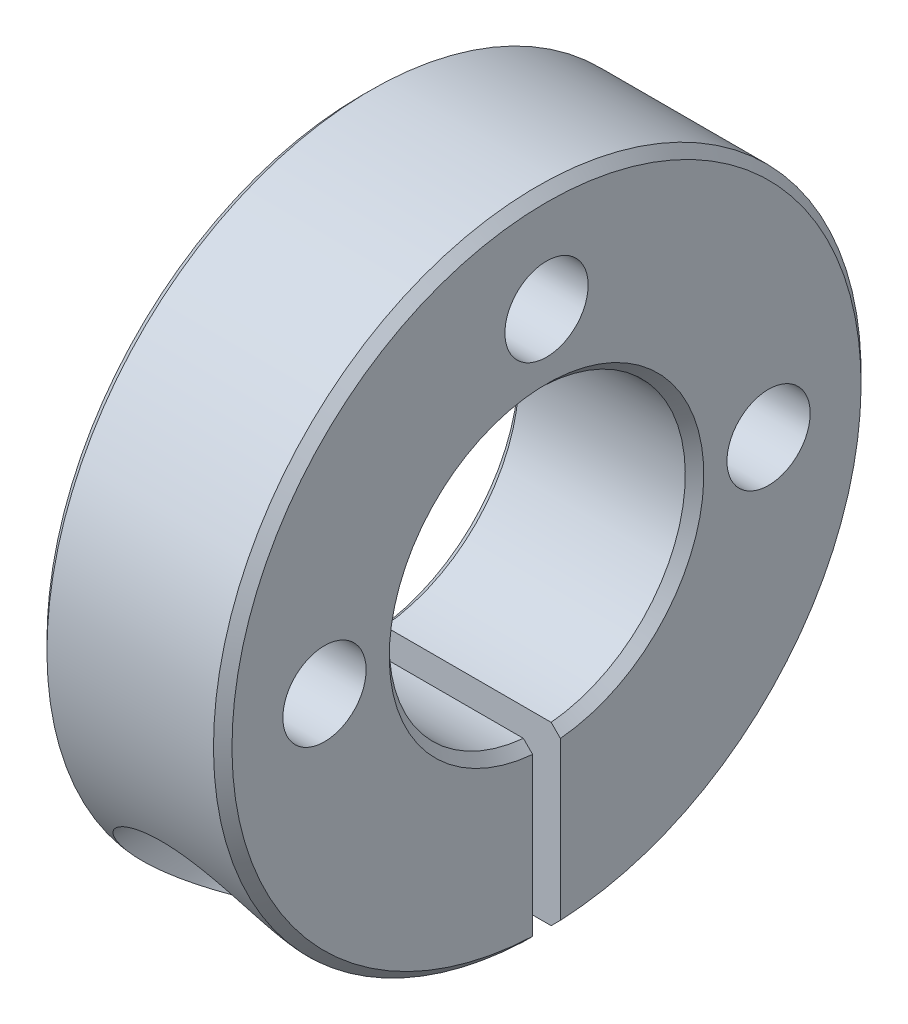
ISO-10303-21;
HEADER;
FILE_DESCRIPTION(('STEP AP214'),'2;1');
FILE_NAME('part.step','',(''),(''),'','','');
FILE_SCHEMA(('AUTOMOTIVE_DESIGN { 1 0 10303 214 1 1 1 1 }'));
ENDSEC;
DATA;
#1=APPLICATION_CONTEXT('core data for automotive mechanical design processes');
#2=APPLICATION_PROTOCOL_DEFINITION('international standard','automotive_design',2000,#1);
#3=PRODUCT_CONTEXT('',#1,'mechanical');
#4=PRODUCT('Part','Part','',(#3));
#5=PRODUCT_RELATED_PRODUCT_CATEGORY('part','',(#4));
#6=PRODUCT_DEFINITION_FORMATION('','',#4);
#7=PRODUCT_DEFINITION_CONTEXT('part definition',#1,'design');
#8=PRODUCT_DEFINITION('design','',#6,#7);
#9=PRODUCT_DEFINITION_SHAPE('','',#8);
#10=(LENGTH_UNIT() NAMED_UNIT(*) SI_UNIT(.MILLI.,.METRE.));
#11=(NAMED_UNIT(*) PLANE_ANGLE_UNIT() SI_UNIT($,.RADIAN.));
#12=(NAMED_UNIT(*) SI_UNIT($,.STERADIAN.) SOLID_ANGLE_UNIT());
#13=UNCERTAINTY_MEASURE_WITH_UNIT(LENGTH_MEASURE(1.E-05),#10,'distance_accuracy_value','');
#14=(GEOMETRIC_REPRESENTATION_CONTEXT(3) GLOBAL_UNCERTAINTY_ASSIGNED_CONTEXT((#13)) GLOBAL_UNIT_ASSIGNED_CONTEXT((#10,
#11,#12)) REPRESENTATION_CONTEXT('',''));
#15=CARTESIAN_POINT('',(0.,0.,0.));
#16=DIRECTION('',(0.,0.,1.));
#17=DIRECTION('',(1.,0.,0.));
#18=AXIS2_PLACEMENT_3D('',#15,#16,#17);
#19=CARTESIAN_POINT('',(0.,-15.625,6.));
#20=DIRECTION('',(0.,0.,-1.));
#21=DIRECTION('',(-1.,0.,0.));
#22=AXIS2_PLACEMENT_3D('',#19,#20,#21);
#23=PLANE('',#22);
#24=CARTESIAN_POINT('',(0.,-12.,6.));
#25=DIRECTION('',(0.,0.,1.));
#26=DIRECTION('',(1.,0.,0.));
#27=AXIS2_PLACEMENT_3D('',#24,#25,#26);
#28=CIRCLE('',#27,2.75);
#29=CARTESIAN_POINT('',(2.75,-12.,6.));
#30=VERTEX_POINT('',#29);
#31=EDGE_CURVE('E142',#30,#30,#28,.F.);
#32=ORIENTED_EDGE('',*,*,#31,.T.);
#33=EDGE_LOOP('',(#32));
#34=FACE_BOUND('',#33,.T.);
#35=CARTESIAN_POINT('',(0.,-12.,6.));
#36=DIRECTION('',(0.,0.,1.));
#37=DIRECTION('',(1.,0.,0.));
#38=AXIS2_PLACEMENT_3D('',#35,#36,#37);
#39=CIRCLE('',#38,4.5);
#40=CARTESIAN_POINT('',(0.73673152950468,-16.4392822227736,6.));
#41=VERTEX_POINT('',#40);
#42=CARTESIAN_POINT('',(-0.736731529504686,-16.4392822227736,6.));
#43=VERTEX_POINT('',#42);
#44=EDGE_CURVE('E201',#41,#43,#39,.T.);
#45=ORIENTED_EDGE('',*,*,#44,.T.);
#46=DIRECTION('',(-1.,0.,0.));
#47=VECTOR('',#46,1.);
#48=CARTESIAN_POINT('',(0.,-16.4392822227736,6.));
#49=LINE('',#48,#47);
#50=EDGE_CURVE('E116',#41,#43,#49,.T.);
#51=ORIENTED_EDGE('',*,*,#50,.F.);
#52=EDGE_LOOP('',(#45,#51));
#53=FACE_BOUND('',#52,.T.);
#54=ADVANCED_FACE('F17',(#34,#53),#23,.F.);
#55=CARTESIAN_POINT('',(5.,0.,0.));
#56=DIRECTION('',(1.,0.,0.));
#57=DIRECTION('',(0.,0.,-1.));
#58=AXIS2_PLACEMENT_3D('',#55,#56,#57);
#59=CONICAL_SURFACE('',#58,8.5,0.785398163397447);
#60=CARTESIAN_POINT('',(5.,0.,0.));
#61=DIRECTION('',(1.,0.,0.));
#62=DIRECTION('',(0.,0.,-1.));
#63=AXIS2_PLACEMENT_3D('',#60,#61,#62);
#64=CIRCLE('',#63,8.5);
#65=CARTESIAN_POINT('',(5.,-8.46684711093805,0.75));
#66=VERTEX_POINT('',#65);
#67=CARTESIAN_POINT('',(5.,-8.46684711093805,-0.75));
#68=VERTEX_POINT('',#67);
#69=EDGE_CURVE('E103',#66,#68,#64,.F.);
#70=ORIENTED_EDGE('',*,*,#69,.F.);
#71=CARTESIAN_POINT('',(4.5,-7.964766161037,0.75));
#72=CARTESIAN_POINT('',(4.58332275788413,-8.04845685099167,0.75));
#73=CARTESIAN_POINT('',(4.66665080349791,-8.13214227513249,0.75));
#74=CARTESIAN_POINT('',(4.83331747016458,-8.29950259176617,0.75));
#75=CARTESIAN_POINT('',(4.91665609121747,-8.38317748425904,0.75));
#76=CARTESIAN_POINT('',(5.,-8.46684711093805,0.75));
#77=B_SPLINE_CURVE_WITH_KNOTS('',3,(#71,#72,#73,#74,#75,#76),.UNSPECIFIED.,.F.,.F.,(4,2,4),(0.,
0.354289882151555,0.70857976421737),.UNSPECIFIED.);
#78=CARTESIAN_POINT('',(4.5,-7.964766161037,0.75));
#79=VERTEX_POINT('',#78);
#80=EDGE_CURVE('E98',#79,#66,#77,.T.);
#81=ORIENTED_EDGE('',*,*,#80,.F.);
#82=CARTESIAN_POINT('',(4.5,0.,0.));
#83=DIRECTION('',(1.,0.,0.));
#84=DIRECTION('',(0.,0.,-1.));
#85=AXIS2_PLACEMENT_3D('',#82,#83,#84);
#86=CIRCLE('',#85,8.);
#87=CARTESIAN_POINT('',(4.5,-7.964766161037,-0.75));
#88=VERTEX_POINT('',#87);
#89=EDGE_CURVE('E95',#79,#88,#86,.F.);
#90=ORIENTED_EDGE('',*,*,#89,.T.);
#91=CARTESIAN_POINT('',(5.,-8.46684711093805,-0.75));
#92=CARTESIAN_POINT('',(4.91665609121747,-8.38317748425903,-0.75));
#93=CARTESIAN_POINT('',(4.83331747016458,-8.29950259176617,-0.75));
#94=CARTESIAN_POINT('',(4.66665080349791,-8.13214227513249,-0.75));
#95=CARTESIAN_POINT('',(4.58332275788413,-8.04845685099167,-0.75));
#96=CARTESIAN_POINT('',(4.5,-7.964766161037,-0.75));
#97=B_SPLINE_CURVE_WITH_KNOTS('',3,(#91,#92,#93,#94,#95,#96),.UNSPECIFIED.,.F.,.F.,(4,2,4),(0.,
0.354289882065815,0.708579764217368),.UNSPECIFIED.);
#98=EDGE_CURVE('E20',#68,#88,#97,.T.);
#99=ORIENTED_EDGE('',*,*,#98,.F.);
#100=EDGE_LOOP('',(#70,#81,#90,#99));
#101=FACE_BOUND('',#100,.T.);
#102=ADVANCED_FACE('F96',(#101),#59,.F.);
#103=CARTESIAN_POINT('',(0.,-12.,11.75));
#104=DIRECTION('',(0.,0.,1.));
#105=DIRECTION('',(1.,0.,0.));
#106=AXIS2_PLACEMENT_3D('',#103,#104,#105);
#107=CYLINDRICAL_SURFACE('',#106,4.5);
#108=ORIENTED_EDGE('',*,*,#44,.F.);
#109=CARTESIAN_POINT('',(4.5,-11.9999999998435,12.7377392030044));
#110=CARTESIAN_POINT('',(4.49999659342949,-12.0897874341693,12.6531545783741));
#111=CARTESIAN_POINT('',(4.49731312864539,-12.1786581120693,12.567636264641));
#112=CARTESIAN_POINT('',(4.48688663633531,-12.3544034048739,12.3949135372549));
#113=CARTESIAN_POINT('',(4.47914482650688,-12.4412784949681,12.3077095343002));
#114=CARTESIAN_POINT('',(4.44881316356375,-12.6984534858054,12.0440633605614));
#115=CARTESIAN_POINT('',(4.41911510353133,-12.8655941536922,11.8653126457182));
#116=CARTESIAN_POINT('',(4.34300028200022,-13.1899676158842,11.5036347251616));
#117=CARTESIAN_POINT('',(4.29663787450371,-13.3472306911807,11.3207228878836));
#118=CARTESIAN_POINT('',(4.18889095652779,-13.652069308479,10.9511831723289));
#119=CARTESIAN_POINT('',(4.12749957141131,-13.7996403778201,10.7645536294696));
#120=CARTESIAN_POINT('',(3.97234024158327,-14.1239410265983,10.3370523978947));
#121=CARTESIAN_POINT('',(3.87431083174871,-14.2975533729783,10.0953554287723));
#122=CARTESIAN_POINT('',(3.65797025694759,-14.6283720850959,9.60974128368812));
#123=CARTESIAN_POINT('',(3.53965059984734,-14.7855715369984,9.36582321876472));
#124=CARTESIAN_POINT('',(3.28294772391242,-15.0840241159876,8.87718244908725));
#125=CARTESIAN_POINT('',(3.14449014430156,-15.2252145310988,8.6324601994707));
#126=CARTESIAN_POINT('',(2.92137069141773,-15.4242486395928,8.26811612733635));
#127=CARTESIAN_POINT('',(2.84445115641557,-15.4884504607233,8.14716110708657));
#128=CARTESIAN_POINT('',(2.68505440427248,-15.6125753987598,7.90669171668996));
#129=CARTESIAN_POINT('',(2.60257700749328,-15.6724983772382,7.78717739325589));
#130=CARTESIAN_POINT('',(2.44457713026749,-15.779111177062,7.56849447785275));
#131=CARTESIAN_POINT('',(2.36991687452591,-15.8264241566887,7.4690068095983));
#132=CARTESIAN_POINT('',(2.21570048504417,-15.9177422565875,7.27236011268131));
#133=CARTESIAN_POINT('',(2.13614567559704,-15.9617482645132,7.17520046393832));
#134=CARTESIAN_POINT('',(1.97209648662688,-16.0458947657934,6.98498274283042));
#135=CARTESIAN_POINT('',(1.88764986079335,-16.0860649462526,6.89189681925615));
#136=CARTESIAN_POINT('',(1.712220341694,-16.1626279531872,6.71037528184055));
#137=CARTESIAN_POINT('',(1.62123814481729,-16.1990211811035,6.62193917427828));
#138=CARTESIAN_POINT('',(1.46789665386435,-16.2543071547525,6.48465075910185));
#139=CARTESIAN_POINT('',(1.40796254193048,-16.274553557651,6.43363905455045));
#140=CARTESIAN_POINT('',(1.28481094764549,-16.3131685469398,6.33508711759034));
#141=CARTESIAN_POINT('',(1.22159675303428,-16.3315389608881,6.28754351976356));
#142=CARTESIAN_POINT('',(1.09065605489364,-16.3663623816907,6.19633599713267));
#143=CARTESIAN_POINT('',(1.02288385375097,-16.3827892170994,6.15272657622926));
#144=CARTESIAN_POINT('',(0.883052649371864,-16.413085151114,6.07145539001137));
#145=CARTESIAN_POINT('',(0.810980866613166,-16.4269460653048,6.03381270963644));
#146=CARTESIAN_POINT('',(0.736731529504679,-16.4392822227736,6.));
#147=B_SPLINE_CURVE_WITH_KNOTS('',3,(#109,#110,#111,#112,#113,#114,#115,#116,#117,#118,#119,
#120,#121,#122,#123,#124,#125,#126,#127,#128,#129,#130,#131,#132,#133,#134,#135,#136,#137,#138,
#139,#140,#141,#142,#143,#144,#145,#146),.UNSPECIFIED.,.F.,.F.,(4,2,2,2,2,2,2,2,2,2,2,2,2,2,2,2,
2,2,4),(0.,0.369981043739814,0.739873054584354,1.47846149267393,2.21466242254255,
2.95120074077436,3.88994335515924,4.82907982731173,5.77177657886501,6.24283785721923,
6.71391436827688,7.11302931588775,7.5120367480017,7.90765137983522,8.30322391982703,
8.54689175245131,8.79031989674821,9.03672247643362,9.28389794154949),.UNSPECIFIED.);
#148=CARTESIAN_POINT('',(4.5,-11.9999999998268,12.7377392030202));
#149=VERTEX_POINT('',#148);
#150=EDGE_CURVE('E102',#149,#41,#147,.T.);
#151=ORIENTED_EDGE('',*,*,#150,.F.);
#152=CARTESIAN_POINT('',(-4.5,-11.99999999981,12.737739203036));
#153=CARTESIAN_POINT('',(-4.49999539061653,-11.8616092664528,12.8681546364716));
#154=CARTESIAN_POINT('',(-4.49361254215694,-11.7209791239297,12.9963428585777));
#155=CARTESIAN_POINT('',(-4.46682850921533,-11.4361114358106,13.2476880032105));
#156=CARTESIAN_POINT('',(-4.44639941679824,-11.2918672603944,13.3708343912689));
#157=CARTESIAN_POINT('',(-4.39006435026275,-11.0002366869138,13.6117915743017));
#158=CARTESIAN_POINT('',(-4.35405630537471,-10.8528357676485,13.7295614174635));
#159=CARTESIAN_POINT('',(-4.26534717436143,-10.5575921225335,13.957864928624));
#160=CARTESIAN_POINT('',(-4.21266081832929,-10.4097499001372,14.0684048784289));
#161=CARTESIAN_POINT('',(-4.10607637056713,-10.155073886505,14.2527950386868));
#162=CARTESIAN_POINT('',(-4.05629224747978,-10.0478750511065,14.3285347856539));
#163=CARTESIAN_POINT('',(-3.9469267446875,-9.83527108127293,14.4752930829882));
#164=CARTESIAN_POINT('',(-3.88734768642697,-9.72986552833794,14.5463127464496));
#165=CARTESIAN_POINT('',(-3.75835851958335,-9.52216893781722,14.6831102548911));
#166=CARTESIAN_POINT('',(-3.68897361374428,-9.41987070823695,14.7489008824213));
#167=CARTESIAN_POINT('',(-3.54025777076305,-9.21932584493091,14.8750818318725));
#168=CARTESIAN_POINT('',(-3.46093165144598,-9.1210772790553,14.9354747455697));
#169=CARTESIAN_POINT('',(-3.2917666677084,-8.92904318946011,15.0510747713074));
#170=CARTESIAN_POINT('',(-3.20184794827299,-8.83530020104871,15.1062359785119));
#171=CARTESIAN_POINT('',(-3.01241487912831,-8.65448186727014,15.2105501837053));
#172=CARTESIAN_POINT('',(-2.91290496754881,-8.5674034711463,15.2597059369457));
#173=CARTESIAN_POINT('',(-2.70472046973333,-8.40107575003517,15.3519048168015));
#174=CARTESIAN_POINT('',(-2.59603690925216,-8.32183426005578,15.3949418446069));
#175=CARTESIAN_POINT('',(-2.37038283582953,-8.17252286823953,15.4747226000714));
#176=CARTESIAN_POINT('',(-2.25341357680604,-8.10245158317862,15.5114672771206));
#177=CARTESIAN_POINT('',(-2.02580991483584,-7.97994244457029,15.5748105614865));
#178=CARTESIAN_POINT('',(-1.91595292317691,-7.92640678307022,15.6020864516105));
#179=CARTESIAN_POINT('',(-1.69129528185993,-7.82812413457123,15.6516294166083));
#180=CARTESIAN_POINT('',(-1.57649517623584,-7.78337618340525,15.6738970410163));
#181=CARTESIAN_POINT('',(-1.34305521321368,-7.70332683043435,15.7133938544858));
#182=CARTESIAN_POINT('',(-1.22442303715565,-7.66800770382113,15.7306325030284));
#183=CARTESIAN_POINT('',(-0.984114524093905,-7.60717929854585,15.7601385584367));
#184=CARTESIAN_POINT('',(-0.862439435021713,-7.58166606643279,15.7724079688619));
#185=CARTESIAN_POINT('',(-0.617810879736317,-7.54089851239679,15.7919396494768));
#186=CARTESIAN_POINT('',(-0.494870993288646,-7.52557813678393,15.7992341668074));
#187=CARTESIAN_POINT('',(-0.247952421934157,-7.50512906089248,15.8089584616371));
#188=CARTESIAN_POINT('',(-0.12397374011922,-7.50000033029017,15.8113882536106));
#189=CARTESIAN_POINT('',(0.115830587649037,-7.49999969140477,15.8113883449709));
#190=CARTESIAN_POINT('',(0.231656861467216,-7.50447619659717,15.8092673544497));
#191=CARTESIAN_POINT('',(0.462504910346273,-7.52233376667457,15.8007782375756));
#192=CARTESIAN_POINT('',(0.577526405100904,-7.53571779188219,15.79440869926));
#193=CARTESIAN_POINT('',(0.806011002067616,-7.57126110956868,15.7774013291384));
#194=CARTESIAN_POINT('',(0.919472304057089,-7.59342978137103,15.7667589350647));
#195=CARTESIAN_POINT('',(1.1439404536115,-7.64630037156955,15.741186489337));
#196=CARTESIAN_POINT('',(1.25494636019469,-7.6770055022605,15.7262548235468));
#197=CARTESIAN_POINT('',(1.47346266005213,-7.74652761037369,15.6921255665428));
#198=CARTESIAN_POINT('',(1.58097959474837,-7.78532825634158,15.6729365589956));
#199=CARTESIAN_POINT('',(1.7920643680299,-7.8706574563293,15.6302599449705));
#200=CARTESIAN_POINT('',(1.895630738014,-7.91718885044308,15.6067707583842));
#201=CARTESIAN_POINT('',(2.098050697467,-8.0174215993435,15.5555171845507));
#202=CARTESIAN_POINT('',(2.19690697730028,-8.0711187928107,15.5277552771321));
#203=CARTESIAN_POINT('',(2.38941678272515,-8.18513312426795,15.4679585170445));
#204=CARTESIAN_POINT('',(2.48306834173282,-8.24545273924262,15.4359220645959));
#205=CARTESIAN_POINT('',(2.66643392045107,-8.37331219645626,15.3669455575566));
#206=CARTESIAN_POINT('',(2.75603264483755,-8.44097174052687,15.329920678444));
#207=CARTESIAN_POINT('',(2.92883533515275,-8.58175973484809,15.2515543208347));
#208=CARTESIAN_POINT('',(3.01203697936666,-8.65489015184053,15.2102112878545));
#209=CARTESIAN_POINT('',(3.25137304338946,-8.88123996500826,15.079912124085));
#210=CARTESIAN_POINT('',(3.39748058354105,-9.04158914211088,14.9845951950441));
#211=CARTESIAN_POINT('',(3.67123302570984,-9.38763310913777,14.7704714072615));
#212=CARTESIAN_POINT('',(3.79661868644918,-9.57432826502663,14.6504271836484));
#213=CARTESIAN_POINT('',(4.01499480652511,-9.95591838879253,14.393840163206));
#214=CARTESIAN_POINT('',(4.10789921250319,-10.1508336279189,14.257254811848));
#215=CARTESIAN_POINT('',(4.24065374121107,-10.4868462961334,14.0109393950778));
#216=CARTESIAN_POINT('',(4.28807788984352,-10.627523789413,13.9045837949003));
#217=CARTESIAN_POINT('',(4.36800524674785,-10.908287757214,13.6854292716179));
#218=CARTESIAN_POINT('',(4.40049638202265,-11.0483736631175,13.5726252176333));
#219=CARTESIAN_POINT('',(4.45141652194372,-11.3256994350007,13.3420706601901));
#220=CARTESIAN_POINT('',(4.46991796018978,-11.4629503315778,13.2243490128252));
#221=CARTESIAN_POINT('',(4.49419557697174,-11.7341370752653,12.9843353343911));
#222=CARTESIAN_POINT('',(4.49999401252421,-11.8680783133372,12.8620516795191));
#223=CARTESIAN_POINT('',(4.5,-11.9999999998435,12.7377392030044));
#224=B_SPLINE_CURVE_WITH_KNOTS('',3,(#152,#153,#154,#155,#156,#157,#158,#159,#160,#161,#162,
#163,#164,#165,#166,#167,#168,#169,#170,#171,#172,#173,#174,#175,#176,#177,#178,#179,#180,#181,
#182,#183,#184,#185,#186,#187,#188,#189,#190,#191,#192,#193,#194,#195,#196,#197,#198,#199,#200,
#201,#202,#203,#204,#205,#206,#207,#208,#209,#210,#211,#212,#213,#214,#215,#216,#217,#218,#219,
#220,#221,#222,#223),.UNSPECIFIED.,.F.,.F.,(4,2,2,2,2,2,2,2,2,2,2,2,2,2,2,2,2,2,2,2,2,2,2,2,2,2,
2,2,2,2,2,2,2,2,2,4),(0.,0.570497506979012,1.14213180121439,1.71756945347468,2.29250029709834,
2.71325056407737,3.13390125469829,3.55348982357356,3.97287582733056,4.3956546025489,
4.8182386761794,5.24124104899476,5.6641795428556,6.03933294061667,6.4144451543985,
6.78884716583171,7.16309807054208,7.53489942639475,7.90669967600695,8.25407841411089,
8.60157265765211,8.94943892308363,9.29743626921901,9.64473825708768,9.9921681187724,
10.3393970920859,10.6867563847978,11.0410213887307,11.3954143662643,12.1032806972175,
12.8651563466623,13.6290354224849,14.1761998383726,14.7238058492638,15.2685567641963,
15.8123524514637),.UNSPECIFIED.);
#225=CARTESIAN_POINT('',(-4.5,-11.99999999981,12.737739203036));
#226=VERTEX_POINT('',#225);
#227=EDGE_CURVE('E135',#226,#149,#224,.T.);
#228=ORIENTED_EDGE('',*,*,#227,.F.);
#229=CARTESIAN_POINT('',(-0.736731529504688,-16.4392822227736,6.));
#230=CARTESIAN_POINT('',(-0.830245933054257,-16.4237242720749,6.04266026829371));
#231=CARTESIAN_POINT('',(-0.920253085481466,-16.4057895409933,6.09125703253371));
#232=CARTESIAN_POINT('',(-1.09345413469577,-16.3660393777581,6.19724290051123));
#233=CARTESIAN_POINT('',(-1.17667913652528,-16.3442433104086,6.25458794060836));
#234=CARTESIAN_POINT('',(-1.33627688246017,-16.2978081799078,6.37460341209999));
#235=CARTESIAN_POINT('',(-1.41273011338457,-16.2732138562293,6.43718671216226));
#236=CARTESIAN_POINT('',(-1.56094708533389,-16.2213281508171,6.56684111704396));
#237=CARTESIAN_POINT('',(-1.63270339149367,-16.1940326570542,6.63391901233011));
#238=CARTESIAN_POINT('',(-1.83804883975631,-16.1101245909419,6.83628094066501));
#239=CARTESIAN_POINT('',(-1.96588036975425,-16.0502159909637,6.97603062058503));
#240=CARTESIAN_POINT('',(-2.20932480205543,-15.9227170785439,7.26235239921848));
#241=CARTESIAN_POINT('',(-2.32493324282362,-15.8551239797469,7.40892696114794));
#242=CARTESIAN_POINT('',(-2.54743030956733,-15.7119147999599,7.70801938442925));
#243=CARTESIAN_POINT('',(-2.65419114968825,-15.6362085984957,7.86058877627355));
#244=CARTESIAN_POINT('',(-2.85864468854056,-15.4777664513751,8.16815280317001));
#245=CARTESIAN_POINT('',(-2.95633493697897,-15.3950286177161,8.32314808040382));
#246=CARTESIAN_POINT('',(-3.19638673350147,-15.1737809185026,8.72261368991943));
#247=CARTESIAN_POINT('',(-3.33267088950761,-15.0302474293268,8.9679875211123));
#248=CARTESIAN_POINT('',(-3.58549705006415,-14.726396759251,9.45868137908578));
#249=CARTESIAN_POINT('',(-3.70202857720947,-14.5660707435668,9.70400130880644));
#250=CARTESIAN_POINT('',(-3.91354345767232,-14.2300803475932,10.1902613892238));
#251=CARTESIAN_POINT('',(-4.00869003524347,-14.0545473879794,10.4312208365234));
#252=CARTESIAN_POINT('',(-4.17651276893551,-13.6874380581581,10.9084662163661));
#253=CARTESIAN_POINT('',(-4.24920465116582,-13.4958730360256,11.1447553107306));
#254=CARTESIAN_POINT('',(-4.36958358741511,-13.0957463379574,11.6123486755947));
#255=CARTESIAN_POINT('',(-4.41709516596905,-12.8870767918747,11.8436074654538));
#256=CARTESIAN_POINT('',(-4.46600581632554,-12.5628597218997,12.1839779836635));
#257=CARTESIAN_POINT('',(-4.47858648371484,-12.4526274439499,12.2966232401995));
#258=CARTESIAN_POINT('',(-4.49558167479281,-12.2287724740676,12.5192688078068));
#259=CARTESIAN_POINT('',(-4.49999080620031,-12.1151475936108,12.62926732512));
#260=CARTESIAN_POINT('',(-4.5,-11.99999999981,12.737739203036));
#261=B_SPLINE_CURVE_WITH_KNOTS('',3,(#229,#230,#231,#232,#233,#234,#235,#236,#237,#238,#239,
#240,#241,#242,#243,#244,#245,#246,#247,#248,#249,#250,#251,#252,#253,#254,#255,#256,#257,#258,
#259,#260),.UNSPECIFIED.,.F.,.F.,(4,2,2,2,2,2,2,2,2,2,2,2,2,2,2,4),(0.,0.311093542300219,
0.620668957484715,0.925850729215554,1.23150444712936,1.82645373151716,2.42161943331315,
3.02426181579633,3.62706652288768,4.57165856914509,5.51675009887682,6.45436262807878,
7.39131700524405,8.33471767969748,8.80880589116533,9.28320683550975),.UNSPECIFIED.);
#262=EDGE_CURVE('E231',#43,#226,#261,.T.);
#263=ORIENTED_EDGE('',*,*,#262,.F.);
#264=EDGE_LOOP('',(#108,#151,#228,#263));
#265=FACE_BOUND('',#264,.T.);
#266=ADVANCED_FACE('F212',(#265),#107,.F.);
#267=CARTESIAN_POINT('',(4.49999999999998,0.,0.));
#268=DIRECTION('',(-1.,0.,0.));
#269=DIRECTION('',(0.,0.,1.));
#270=AXIS2_PLACEMENT_3D('',#267,#268,#269);
#271=CONICAL_SURFACE('',#270,17.5,0.785398163397447);
#272=CARTESIAN_POINT('',(5.,-16.9834478242788,-0.75));
#273=CARTESIAN_POINT('',(4.91666781167346,-17.0668611949739,-0.75));
#274=CARTESIAN_POINT('',(4.83333505084349,-17.1502739937071,-0.75));
#275=CARTESIAN_POINT('',(4.66666838417682,-17.3170984472494,-0.75));
#276=CARTESIAN_POINT('',(4.58333447834012,-17.4005101020586,-0.75));
#277=CARTESIAN_POINT('',(4.49999999999998,-17.4839211849059,-0.75));
#278=B_SPLINE_CURVE_WITH_KNOTS('',3,(#272,#273,#274,#275,#276,#277),.UNSPECIFIED.,.F.,.F.,(4,2,
4),(0.,0.353720788448192,0.707441576895898),.UNSPECIFIED.);
#279=CARTESIAN_POINT('',(5.,-16.9834478242788,-0.75));
#280=VERTEX_POINT('',#279);
#281=CARTESIAN_POINT('',(4.49999999999999,-17.4839211849059,-0.75));
#282=VERTEX_POINT('',#281);
#283=EDGE_CURVE('E143',#280,#282,#278,.T.);
#284=ORIENTED_EDGE('',*,*,#283,.T.);
#285=CARTESIAN_POINT('',(4.5,0.,0.));
#286=DIRECTION('',(1.,0.,0.));
#287=DIRECTION('',(0.,0.,-1.));
#288=AXIS2_PLACEMENT_3D('',#285,#286,#287);
#289=CIRCLE('',#288,17.5);
#290=EDGE_CURVE('E131',#149,#282,#289,.F.);
#291=ORIENTED_EDGE('',*,*,#290,.F.);
#292=CARTESIAN_POINT('',(4.5,0.,0.));
#293=DIRECTION('',(1.,0.,0.));
#294=DIRECTION('',(0.,0.,-1.));
#295=AXIS2_PLACEMENT_3D('',#292,#293,#294);
#296=CIRCLE('',#295,17.5);
#297=CARTESIAN_POINT('',(4.49999999999999,-17.4839211849059,0.75));
#298=VERTEX_POINT('',#297);
#299=EDGE_CURVE('E236',#298,#149,#296,.F.);
#300=ORIENTED_EDGE('',*,*,#299,.F.);
#301=CARTESIAN_POINT('',(4.49999999999999,-17.4839211849059,0.75));
#302=CARTESIAN_POINT('',(4.58333447834012,-17.4005101020586,0.75));
#303=CARTESIAN_POINT('',(4.66666838417682,-17.3170984472494,0.75));
#304=CARTESIAN_POINT('',(4.83333505084349,-17.1502739937071,0.75));
#305=CARTESIAN_POINT('',(4.91666781167346,-17.0668611949739,0.75));
#306=CARTESIAN_POINT('',(4.99999999999999,-16.9834478242788,0.75));
#307=B_SPLINE_CURVE_WITH_KNOTS('',3,(#301,#302,#303,#304,#305,#306),.UNSPECIFIED.,.F.,.F.,(4,2,
4),(0.,0.353720788447705,0.707441576895892),.UNSPECIFIED.);
#308=CARTESIAN_POINT('',(4.99999999999999,-16.9834478242788,0.75));
#309=VERTEX_POINT('',#308);
#310=EDGE_CURVE('E194',#298,#309,#307,.T.);
#311=ORIENTED_EDGE('',*,*,#310,.T.);
#312=CARTESIAN_POINT('',(4.99999999999999,0.,0.));
#313=DIRECTION('',(-1.,0.,0.));
#314=DIRECTION('',(0.,0.,1.));
#315=AXIS2_PLACEMENT_3D('',#312,#313,#314);
#316=CIRCLE('',#315,17.);
#317=EDGE_CURVE('E351',#280,#309,#316,.F.);
#318=ORIENTED_EDGE('',*,*,#317,.F.);
#319=EDGE_LOOP('',(#284,#291,#300,#311,#318));
#320=FACE_BOUND('',#319,.T.);
#321=ADVANCED_FACE('F206',(#320),#271,.T.);
#322=CARTESIAN_POINT('',(0.,-12.,-9.9665));
#323=DIRECTION('',(0.,0.,-1.));
#324=DIRECTION('',(-1.,0.,0.));
#325=AXIS2_PLACEMENT_3D('',#322,#323,#324);
#326=CYLINDRICAL_SURFACE('',#325,2.067);
#327=CARTESIAN_POINT('',(0.,-14.067,-10.4100677711531));
#328=CARTESIAN_POINT('',(0.0855682958530845,-14.0669960439926,-10.4100737507634));
#329=CARTESIAN_POINT('',(0.171159941906338,-14.0616241173871,-10.4173439525807));
#330=CARTESIAN_POINT('',(0.338851691511277,-14.0407951980918,-10.445398641357));
#331=CARTESIAN_POINT('',(0.42094575016855,-14.0253214441293,-10.4662055887162));
#332=CARTESIAN_POINT('',(0.578276805145029,-13.9861010964217,-10.5185557355389));
#333=CARTESIAN_POINT('',(0.653582147064619,-13.9624522889141,-10.54997193373));
#334=CARTESIAN_POINT('',(0.797542503377046,-13.9084898784093,-10.6210125204129));
#335=CARTESIAN_POINT('',(0.866194666835733,-13.8781734363163,-10.6606404050449));
#336=CARTESIAN_POINT('',(1.03720994359814,-13.7918497151965,-10.7722985563003));
#337=CARTESIAN_POINT('',(1.13418710269199,-13.7315439404142,-10.8492188452689));
#338=CARTESIAN_POINT('',(1.31217850700231,-13.6009103352552,-11.0125501521358));
#339=CARTESIAN_POINT('',(1.39314344387208,-13.5305526623177,-11.098989248215));
#340=CARTESIAN_POINT('',(1.52197399420601,-13.4007858070665,-11.2550670142257));
#341=CARTESIAN_POINT('',(1.57305116055229,-13.343046570494,-11.3234927543205));
#342=CARTESIAN_POINT('',(1.6674722589223,-13.2238511629122,-11.4624666247122));
#343=CARTESIAN_POINT('',(1.71081248997055,-13.1623932317795,-11.5330157519792));
#344=CARTESIAN_POINT('',(1.79004292081215,-13.0362352934565,-11.675428043253));
#345=CARTESIAN_POINT('',(1.8259303690718,-12.9715340997733,-11.747291681955));
#346=CARTESIAN_POINT('',(1.89037206614249,-12.8392812440536,-11.891697537273));
#347=CARTESIAN_POINT('',(1.91892346443656,-12.7717284858393,-11.9642400063446));
#348=CARTESIAN_POINT('',(1.99492316709127,-12.5615872841862,-12.1859993371996));
#349=CARTESIAN_POINT('',(2.03061922980313,-12.4148773645248,-12.33553218194));
#350=CARTESIAN_POINT('',(2.06940825672687,-12.1140183554946,-12.6311110613574));
#351=CARTESIAN_POINT('',(2.07253244011935,-11.9598765318077,-12.7771603009502));
#352=CARTESIAN_POINT('',(2.04545236234487,-11.6755497772316,-13.0369436928798));
#353=CARTESIAN_POINT('',(2.0209962373199,-11.5459035507853,-13.1518535968583));
#354=CARTESIAN_POINT('',(1.94508667571353,-11.2878450047744,-13.3739814934767));
#355=CARTESIAN_POINT('',(1.89366554979434,-11.1594313953526,-13.4812085176809));
#356=CARTESIAN_POINT('',(1.77559278488037,-10.9359894009481,-13.6627324471244));
#357=CARTESIAN_POINT('',(1.7145844453063,-10.8397143208109,-13.7391556490097));
#358=CARTESIAN_POINT('',(1.57357281632161,-10.6546963430145,-13.8831235902574));
#359=CARTESIAN_POINT('',(1.49359393680886,-10.5659439632661,-13.9506795672106));
#360=CARTESIAN_POINT('',(1.33008370690017,-10.4145796246096,-14.0639224311941));
#361=CARTESIAN_POINT('',(1.24951625755453,-10.3500953095372,-14.1113727970935));
#362=CARTESIAN_POINT('',(1.07620854491338,-10.2321627249564,-14.1971180530491));
#363=CARTESIAN_POINT('',(0.983466593626102,-10.1787159884546,-14.2354116714431));
#364=CARTESIAN_POINT('',(0.786831252797132,-10.0855107901223,-14.301601378426));
#365=CARTESIAN_POINT('',(0.682860918046525,-10.0458558130359,-14.3294189850874));
#366=CARTESIAN_POINT('',(0.521641462228204,-9.99911858922641,-14.3620324602265));
#367=CARTESIAN_POINT('',(0.467059481818883,-9.98566808176837,-14.371381843198));
#368=CARTESIAN_POINT('',(0.356564543179436,-9.96320868172667,-14.3869615700139));
#369=CARTESIAN_POINT('',(0.300652466050022,-9.95419693017325,-14.3931939215549));
#370=CARTESIAN_POINT('',(0.203895905673891,-9.94267735148527,-14.4011527435803));
#371=CARTESIAN_POINT('',(0.163242925074299,-9.93905256947839,-14.403653901543));
#372=CARTESIAN_POINT('',(0.0817338130508748,-9.93421235328399,-14.40699241773));
#373=CARTESIAN_POINT('',(0.0408776842850319,-9.93299688765571,-14.407829797666));
#374=CARTESIAN_POINT('',(-0.100279236325125,-9.93300763505843,-14.4078239881943));
#375=CARTESIAN_POINT('',(-0.200688192952962,-9.94034862646478,-14.402770415748));
#376=CARTESIAN_POINT('',(-0.398514570377136,-9.96930760107456,-14.3827396342132));
#377=CARTESIAN_POINT('',(-0.495925849319819,-9.9909530869692,-14.3677433084005));
#378=CARTESIAN_POINT('',(-0.684538076597631,-10.0471709587588,-14.3284861448034));
#379=CARTESIAN_POINT('',(-0.775760874811205,-10.0816947292027,-14.3042601417542));
#380=CARTESIAN_POINT('',(-0.950267541794828,-10.1618732000839,-14.2474115693046));
#381=CARTESIAN_POINT('',(-1.03355267531168,-10.207526123121,-14.2147903406317));
#382=CARTESIAN_POINT('',(-1.19502727637271,-10.3106048210717,-14.1402147185203));
#383=CARTESIAN_POINT('',(-1.27271008782174,-10.3685276285212,-14.0978561897383));
#384=CARTESIAN_POINT('',(-1.41694806716739,-10.4920942451752,-14.0061373886426));
#385=CARTESIAN_POINT('',(-1.48349911777202,-10.5577408959642,-13.9567745380704));
#386=CARTESIAN_POINT('',(-1.61500226610925,-10.7055714124985,-13.8437961483807));
#387=CARTESIAN_POINT('',(-1.67799143418224,-10.7887200153537,-13.7791640976019));
#388=CARTESIAN_POINT('',(-1.78903736489184,-10.9596878048683,-13.6435775120409));
#389=CARTESIAN_POINT('',(-1.83707997650999,-11.047511326071,-13.5726170669671));
#390=CARTESIAN_POINT('',(-1.93966691967376,-11.2706464504351,-13.3885240042543));
#391=CARTESIAN_POINT('',(-1.98520857533862,-11.4075089905526,-13.2722150025406));
#392=CARTESIAN_POINT('',(-2.04708391171844,-11.6811329915106,-13.0320548382225));
#393=CARTESIAN_POINT('',(-2.06337867660775,-11.8178940759994,-12.9081938530796));
#394=CARTESIAN_POINT('',(-2.06958854903498,-12.0896833051114,-12.6540390667963));
#395=CARTESIAN_POINT('',(-2.05910170536716,-12.2246541206081,-12.5236763813965));
#396=CARTESIAN_POINT('',(-2.01294865332033,-12.4883409302908,-12.260751706124));
#397=CARTESIAN_POINT('',(-1.97724923216362,-12.6170484344407,-12.1281870407346));
#398=CARTESIAN_POINT('',(-1.90072003849787,-12.8161828628844,-11.9166859022123));
#399=CARTESIAN_POINT('',(-1.86762376793387,-12.8893692668705,-11.8374610306453));
#400=CARTESIAN_POINT('',(-1.79260365505933,-13.032268372051,-11.679951711851));
#401=CARTESIAN_POINT('',(-1.75067606355016,-13.1019795823126,-11.6016676790101));
#402=CARTESIAN_POINT('',(-1.65786891969205,-13.2372034198475,-11.4471379043319));
#403=CARTESIAN_POINT('',(-1.60700911170361,-13.3027248814531,-11.3708880855168));
#404=CARTESIAN_POINT('',(-1.49583854790461,-13.4289947987893,-11.2214814885201));
#405=CARTESIAN_POINT('',(-1.43553684094962,-13.4897477416968,-11.1483218331841));
#406=CARTESIAN_POINT('',(-1.30470363877038,-13.6055774620604,-11.0066629806352));
#407=CARTESIAN_POINT('',(-1.23416948138688,-13.660652755974,-10.9381650030774));
#408=CARTESIAN_POINT('',(-1.08201505995757,-13.7635617828232,-10.8083854593488));
#409=CARTESIAN_POINT('',(-1.00040969167148,-13.8114050662704,-10.7470944000016));
#410=CARTESIAN_POINT('',(-0.8430813472093,-13.8888500260271,-10.6467379230824));
#411=CARTESIAN_POINT('',(-0.769501768148454,-13.9201842366023,-10.6056840164158));
#412=CARTESIAN_POINT('',(-0.614991772580691,-13.9750864476208,-10.5332344384931));
#413=CARTESIAN_POINT('',(-0.534071350719414,-13.9986648111462,-10.5018258832273));
#414=CARTESIAN_POINT('',(-0.378230884740549,-14.0334332751475,-10.4553087652665));
#415=CARTESIAN_POINT('',(-0.30411559553418,-14.0459153886086,-10.438508148361));
#416=CARTESIAN_POINT('',(-0.15333809381337,-14.0626965597641,-10.4158902923125));
#417=CARTESIAN_POINT('',(-0.076678422120505,-14.0670035450093,-10.4100624127773));
#418=CARTESIAN_POINT('',(0.,-14.067,-10.4100677711531));
#419=B_SPLINE_CURVE_WITH_KNOTS('',3,(#327,#328,#329,#330,#331,#332,#333,#334,#335,#336,#337,
#338,#339,#340,#341,#342,#343,#344,#345,#346,#347,#348,#349,#350,#351,#352,#353,#354,#355,#356,
#357,#358,#359,#360,#361,#362,#363,#364,#365,#366,#367,#368,#369,#370,#371,#372,#373,#374,#375,
#376,#377,#378,#379,#380,#381,#382,#383,#384,#385,#386,#387,#388,#389,#390,#391,#392,#393,#394,
#395,#396,#397,#398,#399,#400,#401,#402,#403,#404,#405,#406,#407,#408,#409,#410,#411,#412,#413,
#414,#415,#416,#417,#418),.UNSPECIFIED.,.T.,.F.,(4,2,2,2,2,2,2,2,2,2,2,2,2,2,2,2,2,2,2,2,2,2,2,
2,2,2,2,2,2,2,2,2,2,2,2,2,2,2,2,2,2,2,2,2,2,4),(0.,0.256310045594889,0.513046453550031,
0.766812478124282,1.02068676683547,1.4314524487696,1.84346400106949,2.15230768351373,
2.46129870825363,2.7704036090673,3.07962843556773,3.71441177329975,4.34858663402526,
4.87155785867519,5.39390386304887,5.80406024946581,6.21369171267972,6.55304106523977,
6.89243751829892,7.23432826794466,7.40506387882647,7.57568937589393,7.69825852746156,
7.82082607953275,8.12150310502755,8.42275991894545,8.72289081317193,9.02297380585122,
9.33901798310633,9.65517879801615,10.0219721398595,10.3891117028349,10.9419533313173,
11.4955300254174,12.0574637295413,12.6201390585509,12.9582549140696,13.2965146017242,
13.6340357787034,13.9712354425502,14.3085229929181,14.6453611589264,14.9141354505534,
15.1825491429495,15.4124536444703,15.6421350898458),.UNSPECIFIED.);
#420=CARTESIAN_POINT('',(0.,-14.067,-10.4100677711531));
#421=VERTEX_POINT('',#420);
#422=EDGE_CURVE('E134',#421,#421,#419,.T.);
#423=ORIENTED_EDGE('',*,*,#422,.F.);
#424=EDGE_LOOP('',(#423));
#425=FACE_BOUND('',#424,.T.);
#426=CARTESIAN_POINT('',(0.,-12.,-1.18299999996907));
#427=DIRECTION('',(0.,0.,1.));
#428=DIRECTION('',(0.,1.,0.));
#429=AXIS2_PLACEMENT_3D('',#426,#427,#428);
#430=CIRCLE('',#429,2.06700000006731);
#431=CARTESIAN_POINT('',(0.,-9.93299999993269,-1.18299999996907));
#432=VERTEX_POINT('',#431);
#433=EDGE_CURVE('E140',#432,#432,#430,.T.);
#434=ORIENTED_EDGE('',*,*,#433,.T.);
#435=EDGE_LOOP('',(#434));
#436=FACE_BOUND('',#435,.T.);
#437=ADVANCED_FACE('F211',(#425,#436),#326,.F.);
#438=CARTESIAN_POINT('',(0.,-12.,-0.749999999982265));
#439=DIRECTION('',(0.,0.,1.));
#440=DIRECTION('',(1.,0.,0.));
#441=AXIS2_PLACEMENT_3D('',#438,#439,#440);
#442=CONICAL_SURFACE('',#441,2.50000000005412,0.785398163397448);
#443=ORIENTED_EDGE('',*,*,#433,.F.);
#444=EDGE_LOOP('',(#443));
#445=FACE_BOUND('',#444,.T.);
#446=CARTESIAN_POINT('',(0.,-12.,-0.749999999982265));
#447=DIRECTION('',(0.,0.,1.));
#448=DIRECTION('',(1.,0.,0.));
#449=AXIS2_PLACEMENT_3D('',#446,#447,#448);
#450=CIRCLE('',#449,2.50000000005412);
#451=CARTESIAN_POINT('',(2.50000000005412,-12.,-0.749999999982265));
#452=VERTEX_POINT('',#451);
#453=EDGE_CURVE('E120',#452,#452,#450,.T.);
#454=ORIENTED_EDGE('',*,*,#453,.T.);
#455=EDGE_LOOP('',(#454));
#456=FACE_BOUND('',#455,.T.);
#457=ADVANCED_FACE('F259',(#445,#456),#442,.F.);
#458=CARTESIAN_POINT('',(0.,-12.,3.));
#459=DIRECTION('',(0.,0.,1.));
#460=DIRECTION('',(1.,0.,0.));
#461=AXIS2_PLACEMENT_3D('',#458,#459,#460);
#462=CYLINDRICAL_SURFACE('',#461,2.75);
#463=CARTESIAN_POINT('',(0.,-12.,0.75));
#464=DIRECTION('',(0.,0.,1.));
#465=DIRECTION('',(1.,0.,0.));
#466=AXIS2_PLACEMENT_3D('',#463,#464,#465);
#467=CIRCLE('',#466,2.75);
#468=CARTESIAN_POINT('',(2.75,-12.,0.75));
#469=VERTEX_POINT('',#468);
#470=EDGE_CURVE('E341',#469,#469,#467,.F.);
#471=ORIENTED_EDGE('',*,*,#470,.T.);
#472=EDGE_LOOP('',(#471));
#473=FACE_BOUND('',#472,.T.);
#474=ORIENTED_EDGE('',*,*,#31,.F.);
#475=EDGE_LOOP('',(#474));
#476=FACE_BOUND('',#475,.T.);
#477=ADVANCED_FACE('F256',(#473,#476),#462,.F.);
#478=CARTESIAN_POINT('',(5.,12.75,0.));
#479=DIRECTION('',(1.,0.,0.));
#480=DIRECTION('',(0.,0.,-1.));
#481=AXIS2_PLACEMENT_3D('',#478,#479,#480);
#482=PLANE('',#481);
#483=DIRECTION('',(0.,1.,0.));
#484=VECTOR('',#483,1.);
#485=CARTESIAN_POINT('',(5.,0.,0.75));
#486=LINE('',#485,#484);
#487=EDGE_CURVE('E129',#309,#66,#486,.T.);
#488=ORIENTED_EDGE('',*,*,#487,.T.);
#489=ORIENTED_EDGE('',*,*,#69,.T.);
#490=DIRECTION('',(0.,1.,0.));
#491=VECTOR('',#490,1.);
#492=CARTESIAN_POINT('',(5.,-17.5,-0.75));
#493=LINE('',#492,#491);
#494=EDGE_CURVE('E115',#68,#280,#493,.F.);
#495=ORIENTED_EDGE('',*,*,#494,.T.);
#496=ORIENTED_EDGE('',*,*,#317,.T.);
#497=EDGE_LOOP('',(#488,#489,#495,#496));
#498=FACE_BOUND('',#497,.T.);
#499=CARTESIAN_POINT('',(5.,0.,-12.));
#500=DIRECTION('',(1.,0.,0.));
#501=DIRECTION('',(0.,0.,-1.));
#502=AXIS2_PLACEMENT_3D('',#499,#500,#501);
#503=CIRCLE('',#502,2.25);
#504=CARTESIAN_POINT('',(5.,0.,-14.25));
#505=VERTEX_POINT('',#504);
#506=EDGE_CURVE('E125',#505,#505,#503,.F.);
#507=ORIENTED_EDGE('',*,*,#506,.T.);
#508=EDGE_LOOP('',(#507));
#509=FACE_BOUND('',#508,.T.);
#510=CARTESIAN_POINT('',(5.,0.,12.));
#511=DIRECTION('',(1.,0.,0.));
#512=DIRECTION('',(0.,0.,-1.));
#513=AXIS2_PLACEMENT_3D('',#510,#511,#512);
#514=CIRCLE('',#513,2.25);
#515=CARTESIAN_POINT('',(5.,0.,9.75));
#516=VERTEX_POINT('',#515);
#517=EDGE_CURVE('E306',#516,#516,#514,.F.);
#518=ORIENTED_EDGE('',*,*,#517,.T.);
#519=EDGE_LOOP('',(#518));
#520=FACE_BOUND('',#519,.T.);
#521=CARTESIAN_POINT('',(5.,12.,0.));
#522=DIRECTION('',(1.,0.,0.));
#523=DIRECTION('',(0.,0.,-1.));
#524=AXIS2_PLACEMENT_3D('',#521,#522,#523);
#525=CIRCLE('',#524,2.25);
#526=CARTESIAN_POINT('',(5.,12.,-2.25));
#527=VERTEX_POINT('',#526);
#528=EDGE_CURVE('E309',#527,#527,#525,.F.);
#529=ORIENTED_EDGE('',*,*,#528,.T.);
#530=EDGE_LOOP('',(#529));
#531=FACE_BOUND('',#530,.T.);
#532=ADVANCED_FACE('F253',(#498,#509,#520,#531),#482,.T.);
#533=CARTESIAN_POINT('',(0.,0.,0.));
#534=DIRECTION('',(1.,0.,0.));
#535=DIRECTION('',(0.,0.,-1.));
#536=AXIS2_PLACEMENT_3D('',#533,#534,#535);
#537=CYLINDRICAL_SURFACE('',#536,8.);
#538=ORIENTED_EDGE('',*,*,#89,.F.);
#539=DIRECTION('',(1.,0.,0.));
#540=VECTOR('',#539,1.);
#541=CARTESIAN_POINT('',(5.,-7.964766161037,0.75));
#542=LINE('',#541,#540);
#543=CARTESIAN_POINT('',(-4.5,-7.964766161037,0.75));
#544=VERTEX_POINT('',#543);
#545=EDGE_CURVE('E345',#79,#544,#542,.F.);
#546=ORIENTED_EDGE('',*,*,#545,.T.);
#547=CARTESIAN_POINT('',(-4.5,0.,0.));
#548=DIRECTION('',(-1.,0.,0.));
#549=DIRECTION('',(0.,1.,0.));
#550=AXIS2_PLACEMENT_3D('',#547,#548,#549);
#551=CIRCLE('',#550,8.);
#552=CARTESIAN_POINT('',(-4.5,-7.964766161037,-0.75));
#553=VERTEX_POINT('',#552);
#554=EDGE_CURVE('E119',#544,#553,#551,.T.);
#555=ORIENTED_EDGE('',*,*,#554,.T.);
#556=DIRECTION('',(-1.,0.,0.));
#557=VECTOR('',#556,1.);
#558=CARTESIAN_POINT('',(5.,-7.964766161037,-0.75));
#559=LINE('',#558,#557);
#560=EDGE_CURVE('E111',#553,#88,#559,.F.);
#561=ORIENTED_EDGE('',*,*,#560,.T.);
#562=EDGE_LOOP('',(#538,#546,#555,#561));
#563=FACE_BOUND('',#562,.T.);
#564=ADVANCED_FACE('F117',(#563),#537,.F.);
#565=CARTESIAN_POINT('',(0.,0.,0.));
#566=DIRECTION('',(1.,0.,0.));
#567=DIRECTION('',(0.,0.,-1.));
#568=AXIS2_PLACEMENT_3D('',#565,#566,#567);
#569=CYLINDRICAL_SURFACE('',#568,17.5);
#570=DIRECTION('',(1.,0.,0.));
#571=VECTOR('',#570,1.);
#572=CARTESIAN_POINT('',(5.,-17.4839211849059,0.75));
#573=LINE('',#572,#571);
#574=CARTESIAN_POINT('',(-4.49999999999997,-17.4839211849059,0.75));
#575=VERTEX_POINT('',#574);
#576=EDGE_CURVE('E338',#575,#298,#573,.T.);
#577=ORIENTED_EDGE('',*,*,#576,.T.);
#578=ORIENTED_EDGE('',*,*,#299,.T.);
#579=ORIENTED_EDGE('',*,*,#150,.T.);
#580=ORIENTED_EDGE('',*,*,#50,.T.);
#581=ORIENTED_EDGE('',*,*,#262,.T.);
#582=CARTESIAN_POINT('',(-4.49999999999998,0.,0.));
#583=DIRECTION('',(1.,0.,0.));
#584=DIRECTION('',(0.,1.,0.));
#585=AXIS2_PLACEMENT_3D('',#582,#583,#584);
#586=CIRCLE('',#585,17.5);
#587=EDGE_CURVE('E329',#575,#226,#586,.F.);
#588=ORIENTED_EDGE('',*,*,#587,.F.);
#589=EDGE_LOOP('',(#577,#578,#579,#580,#581,#588));
#590=FACE_BOUND('',#589,.T.);
#591=ADVANCED_FACE('F242',(#590),#569,.T.);
#592=CARTESIAN_POINT('',(0.,0.,0.));
#593=DIRECTION('',(1.,0.,0.));
#594=DIRECTION('',(0.,0.,-1.));
#595=AXIS2_PLACEMENT_3D('',#592,#593,#594);
#596=CYLINDRICAL_SURFACE('',#595,17.5);
#597=ORIENTED_EDGE('',*,*,#422,.T.);
#598=EDGE_LOOP('',(#597));
#599=FACE_BOUND('',#598,.T.);
#600=DIRECTION('',(-1.,0.,0.));
#601=VECTOR('',#600,1.);
#602=CARTESIAN_POINT('',(5.,-17.4839211849059,-0.75));
#603=LINE('',#602,#601);
#604=CARTESIAN_POINT('',(-4.49999999999998,-17.4839211849059,-0.75));
#605=VERTEX_POINT('',#604);
#606=EDGE_CURVE('E122',#282,#605,#603,.T.);
#607=ORIENTED_EDGE('',*,*,#606,.T.);
#608=CARTESIAN_POINT('',(-4.5,0.,0.));
#609=DIRECTION('',(1.,0.,0.));
#610=DIRECTION('',(0.,1.,0.));
#611=AXIS2_PLACEMENT_3D('',#608,#609,#610);
#612=CIRCLE('',#611,17.5);
#613=EDGE_CURVE('E164',#226,#605,#612,.F.);
#614=ORIENTED_EDGE('',*,*,#613,.F.);
#615=ORIENTED_EDGE('',*,*,#227,.T.);
#616=ORIENTED_EDGE('',*,*,#290,.T.);
#617=EDGE_LOOP('',(#607,#614,#615,#616));
#618=FACE_BOUND('',#617,.T.);
#619=ADVANCED_FACE('F246',(#599,#618),#596,.T.);
#620=CARTESIAN_POINT('',(10.,12.,0.));
#621=DIRECTION('',(1.,0.,0.));
#622=DIRECTION('',(0.,0.,-1.));
#623=AXIS2_PLACEMENT_3D('',#620,#621,#622);
#624=CYLINDRICAL_SURFACE('',#623,2.25);
#625=ORIENTED_EDGE('',*,*,#528,.F.);
#626=EDGE_LOOP('',(#625));
#627=FACE_BOUND('',#626,.T.);
#628=CARTESIAN_POINT('',(-5.,12.,0.));
#629=DIRECTION('',(1.,0.,0.));
#630=DIRECTION('',(0.,0.,-1.));
#631=AXIS2_PLACEMENT_3D('',#628,#629,#630);
#632=CIRCLE('',#631,2.25);
#633=CARTESIAN_POINT('',(-5.,12.,-2.25));
#634=VERTEX_POINT('',#633);
#635=EDGE_CURVE('E154',#634,#634,#632,.T.);
#636=ORIENTED_EDGE('',*,*,#635,.F.);
#637=EDGE_LOOP('',(#636));
#638=FACE_BOUND('',#637,.T.);
#639=ADVANCED_FACE('F284',(#627,#638),#624,.F.);
#640=CARTESIAN_POINT('',(10.,0.,12.));
#641=DIRECTION('',(1.,0.,0.));
#642=DIRECTION('',(0.,0.,-1.));
#643=AXIS2_PLACEMENT_3D('',#640,#641,#642);
#644=CYLINDRICAL_SURFACE('',#643,2.25);
#645=ORIENTED_EDGE('',*,*,#517,.F.);
#646=EDGE_LOOP('',(#645));
#647=FACE_BOUND('',#646,.T.);
#648=CARTESIAN_POINT('',(-5.,0.,12.));
#649=DIRECTION('',(1.,0.,0.));
#650=DIRECTION('',(0.,0.,-1.));
#651=AXIS2_PLACEMENT_3D('',#648,#649,#650);
#652=CIRCLE('',#651,2.25);
#653=CARTESIAN_POINT('',(-5.,0.,9.75));
#654=VERTEX_POINT('',#653);
#655=EDGE_CURVE('E151',#654,#654,#652,.T.);
#656=ORIENTED_EDGE('',*,*,#655,.F.);
#657=EDGE_LOOP('',(#656));
#658=FACE_BOUND('',#657,.T.);
#659=ADVANCED_FACE('F286',(#647,#658),#644,.F.);
#660=CARTESIAN_POINT('',(10.,0.,-12.));
#661=DIRECTION('',(1.,0.,0.));
#662=DIRECTION('',(0.,0.,-1.));
#663=AXIS2_PLACEMENT_3D('',#660,#661,#662);
#664=CYLINDRICAL_SURFACE('',#663,2.25);
#665=ORIENTED_EDGE('',*,*,#506,.F.);
#666=EDGE_LOOP('',(#665));
#667=FACE_BOUND('',#666,.T.);
#668=CARTESIAN_POINT('',(-5.,0.,-12.));
#669=DIRECTION('',(1.,0.,0.));
#670=DIRECTION('',(0.,0.,-1.));
#671=AXIS2_PLACEMENT_3D('',#668,#669,#670);
#672=CIRCLE('',#671,2.25);
#673=CARTESIAN_POINT('',(-5.,0.,-14.25));
#674=VERTEX_POINT('',#673);
#675=EDGE_CURVE('E148',#674,#674,#672,.T.);
#676=ORIENTED_EDGE('',*,*,#675,.F.);
#677=EDGE_LOOP('',(#676));
#678=FACE_BOUND('',#677,.T.);
#679=ADVANCED_FACE('F292',(#667,#678),#664,.F.);
#680=CARTESIAN_POINT('',(5.,-17.5,-0.75));
#681=DIRECTION('',(0.,0.,-1.));
#682=DIRECTION('',(-1.,0.,0.));
#683=AXIS2_PLACEMENT_3D('',#680,#681,#682);
#684=PLANE('',#683);
#685=ORIENTED_EDGE('',*,*,#606,.F.);
#686=ORIENTED_EDGE('',*,*,#283,.F.);
#687=ORIENTED_EDGE('',*,*,#494,.F.);
#688=ORIENTED_EDGE('',*,*,#98,.T.);
#689=ORIENTED_EDGE('',*,*,#560,.F.);
#690=CARTESIAN_POINT('',(-4.5,-7.964766161037,-0.75));
#691=CARTESIAN_POINT('',(-4.58332275788413,-8.04845685099167,-0.75));
#692=CARTESIAN_POINT('',(-4.66665080349791,-8.13214227513249,-0.75));
#693=CARTESIAN_POINT('',(-4.83331747016458,-8.29950259176617,-0.75));
#694=CARTESIAN_POINT('',(-4.91665609121747,-8.38317748425904,-0.75));
#695=CARTESIAN_POINT('',(-5.,-8.46684711093805,-0.75));
#696=B_SPLINE_CURVE_WITH_KNOTS('',3,(#690,#691,#692,#693,#694,#695),.UNSPECIFIED.,.F.,.F.,(4,2,
4),(0.,0.354289882151555,0.70857976421737),.UNSPECIFIED.);
#697=CARTESIAN_POINT('',(-5.,-8.46684711093805,-0.75));
#698=VERTEX_POINT('',#697);
#699=EDGE_CURVE('E325',#553,#698,#696,.T.);
#700=ORIENTED_EDGE('',*,*,#699,.T.);
#701=DIRECTION('',(0.,1.,0.));
#702=VECTOR('',#701,1.);
#703=CARTESIAN_POINT('',(-5.,12.75,-0.75));
#704=LINE('',#703,#702);
#705=CARTESIAN_POINT('',(-5.,-16.9834478242788,-0.75));
#706=VERTEX_POINT('',#705);
#707=EDGE_CURVE('E147',#706,#698,#704,.T.);
#708=ORIENTED_EDGE('',*,*,#707,.F.);
#709=CARTESIAN_POINT('',(-4.49999999999998,-17.4839211849059,-0.75));
#710=CARTESIAN_POINT('',(-4.58333447834011,-17.4005101020586,-0.75));
#711=CARTESIAN_POINT('',(-4.66666838417682,-17.3170984472494,-0.75));
#712=CARTESIAN_POINT('',(-4.83333505084349,-17.1502739937071,-0.75));
#713=CARTESIAN_POINT('',(-4.91666781167346,-17.0668611949739,-0.75));
#714=CARTESIAN_POINT('',(-4.99999999999999,-16.9834478242788,-0.75));
#715=B_SPLINE_CURVE_WITH_KNOTS('',3,(#709,#710,#711,#712,#713,#714),.UNSPECIFIED.,.F.,.F.,(4,2,
4),(0.,0.353720788447707,0.707441576895897),.UNSPECIFIED.);
#716=EDGE_CURVE('E157',#605,#706,#715,.T.);
#717=ORIENTED_EDGE('',*,*,#716,.F.);
#718=EDGE_LOOP('',(#685,#686,#687,#688,#689,#700,#708,#717));
#719=FACE_BOUND('',#718,.T.);
#720=ORIENTED_EDGE('',*,*,#453,.F.);
#721=EDGE_LOOP('',(#720));
#722=FACE_BOUND('',#721,.T.);
#723=ADVANCED_FACE('F109',(#719,#722),#684,.F.);
#724=CARTESIAN_POINT('',(-5.,0.,0.));
#725=DIRECTION('',(-1.,0.,0.));
#726=DIRECTION('',(0.,0.,1.));
#727=AXIS2_PLACEMENT_3D('',#724,#725,#726);
#728=CONICAL_SURFACE('',#727,8.5,0.785398163397448);
#729=ORIENTED_EDGE('',*,*,#554,.F.);
#730=CARTESIAN_POINT('',(-4.5,-7.964766161037,0.75));
#731=CARTESIAN_POINT('',(-4.58332275788413,-8.04845685099167,0.75));
#732=CARTESIAN_POINT('',(-4.66665080349791,-8.13214227513249,0.75));
#733=CARTESIAN_POINT('',(-4.83331747016458,-8.29950259176617,0.75));
#734=CARTESIAN_POINT('',(-4.91665609121747,-8.38317748425903,0.75));
#735=CARTESIAN_POINT('',(-5.,-8.46684711093805,0.75));
#736=B_SPLINE_CURVE_WITH_KNOTS('',3,(#730,#731,#732,#733,#734,#735),.UNSPECIFIED.,.F.,.F.,(4,2,
4),(0.,0.354289882151552,0.708579764217368),.UNSPECIFIED.);
#737=CARTESIAN_POINT('',(-5.,-8.46684711093805,0.75));
#738=VERTEX_POINT('',#737);
#739=EDGE_CURVE('E187',#544,#738,#736,.T.);
#740=ORIENTED_EDGE('',*,*,#739,.T.);
#741=CARTESIAN_POINT('',(-5.,0.,0.));
#742=DIRECTION('',(-1.,0.,0.));
#743=DIRECTION('',(0.,0.,1.));
#744=AXIS2_PLACEMENT_3D('',#741,#742,#743);
#745=CIRCLE('',#744,8.5);
#746=EDGE_CURVE('E145',#698,#738,#745,.F.);
#747=ORIENTED_EDGE('',*,*,#746,.F.);
#748=ORIENTED_EDGE('',*,*,#699,.F.);
#749=EDGE_LOOP('',(#729,#740,#747,#748));
#750=FACE_BOUND('',#749,.T.);
#751=ADVANCED_FACE('F183',(#750),#728,.F.);
#752=CARTESIAN_POINT('',(5.,0.,0.75));
#753=DIRECTION('',(0.,0.,1.));
#754=DIRECTION('',(1.,0.,0.));
#755=AXIS2_PLACEMENT_3D('',#752,#753,#754);
#756=PLANE('',#755);
#757=DIRECTION('',(0.,1.,0.));
#758=VECTOR('',#757,1.);
#759=CARTESIAN_POINT('',(-5.,12.75,0.75));
#760=LINE('',#759,#758);
#761=CARTESIAN_POINT('',(-5.,-16.9834478242788,0.75));
#762=VERTEX_POINT('',#761);
#763=EDGE_CURVE('E30',#738,#762,#760,.F.);
#764=ORIENTED_EDGE('',*,*,#763,.F.);
#765=ORIENTED_EDGE('',*,*,#739,.F.);
#766=ORIENTED_EDGE('',*,*,#545,.F.);
#767=ORIENTED_EDGE('',*,*,#80,.T.);
#768=ORIENTED_EDGE('',*,*,#487,.F.);
#769=ORIENTED_EDGE('',*,*,#310,.F.);
#770=ORIENTED_EDGE('',*,*,#576,.F.);
#771=CARTESIAN_POINT('',(-5.,-16.9834478242788,0.75));
#772=CARTESIAN_POINT('',(-4.91666781167346,-17.0668611949739,0.75));
#773=CARTESIAN_POINT('',(-4.83333505084349,-17.1502739937071,0.75));
#774=CARTESIAN_POINT('',(-4.66666838417682,-17.3170984472494,0.75));
#775=CARTESIAN_POINT('',(-4.58333447834011,-17.4005101020586,0.75));
#776=CARTESIAN_POINT('',(-4.49999999999998,-17.4839211849059,0.75));
#777=B_SPLINE_CURVE_WITH_KNOTS('',3,(#771,#772,#773,#774,#775,#776),.UNSPECIFIED.,.F.,.F.,(4,2,
4),(0.,0.353720788448194,0.707441576895907),.UNSPECIFIED.);
#778=EDGE_CURVE('E39',#762,#575,#777,.T.);
#779=ORIENTED_EDGE('',*,*,#778,.F.);
#780=EDGE_LOOP('',(#764,#765,#766,#767,#768,#769,#770,#779));
#781=FACE_BOUND('',#780,.T.);
#782=ORIENTED_EDGE('',*,*,#470,.F.);
#783=EDGE_LOOP('',(#782));
#784=FACE_BOUND('',#783,.T.);
#785=ADVANCED_FACE('F178',(#781,#784),#756,.F.);
#786=CARTESIAN_POINT('',(-4.49999999999998,0.,0.));
#787=DIRECTION('',(1.,0.,0.));
#788=DIRECTION('',(0.,0.,-1.));
#789=AXIS2_PLACEMENT_3D('',#786,#787,#788);
#790=CONICAL_SURFACE('',#789,17.5,0.785398163397447);
#791=ORIENTED_EDGE('',*,*,#716,.T.);
#792=CARTESIAN_POINT('',(-5.,0.,0.));
#793=DIRECTION('',(1.,0.,0.));
#794=DIRECTION('',(0.,0.,-1.));
#795=AXIS2_PLACEMENT_3D('',#792,#793,#794);
#796=CIRCLE('',#795,17.);
#797=EDGE_CURVE('E11',#762,#706,#796,.F.);
#798=ORIENTED_EDGE('',*,*,#797,.F.);
#799=ORIENTED_EDGE('',*,*,#778,.T.);
#800=ORIENTED_EDGE('',*,*,#587,.T.);
#801=ORIENTED_EDGE('',*,*,#613,.T.);
#802=EDGE_LOOP('',(#791,#798,#799,#800,#801));
#803=FACE_BOUND('',#802,.T.);
#804=ADVANCED_FACE('F173',(#803),#790,.T.);
#805=CARTESIAN_POINT('',(-5.,12.75,0.));
#806=DIRECTION('',(-1.,0.,0.));
#807=DIRECTION('',(0.,0.,1.));
#808=AXIS2_PLACEMENT_3D('',#805,#806,#807);
#809=PLANE('',#808);
#810=ORIENTED_EDGE('',*,*,#797,.T.);
#811=ORIENTED_EDGE('',*,*,#707,.T.);
#812=ORIENTED_EDGE('',*,*,#746,.T.);
#813=ORIENTED_EDGE('',*,*,#763,.T.);
#814=EDGE_LOOP('',(#810,#811,#812,#813));
#815=FACE_BOUND('',#814,.T.);
#816=ORIENTED_EDGE('',*,*,#675,.T.);
#817=EDGE_LOOP('',(#816));
#818=FACE_BOUND('',#817,.T.);
#819=ORIENTED_EDGE('',*,*,#655,.T.);
#820=EDGE_LOOP('',(#819));
#821=FACE_BOUND('',#820,.T.);
#822=ORIENTED_EDGE('',*,*,#635,.T.);
#823=EDGE_LOOP('',(#822));
#824=FACE_BOUND('',#823,.T.);
#825=ADVANCED_FACE('F177',(#815,#818,#821,#824),#809,.T.);
#826=CLOSED_SHELL('',(#54,#102,#266,#321,#437,#457,#477,#532,#564,#591,#619,#639,#659,#679,#723,
#751,#785,#804,#825));
#827=MANIFOLD_SOLID_BREP('B1',#826);
#828=ADVANCED_BREP_SHAPE_REPRESENTATION('',(#18,#827),#14);
#829=SHAPE_DEFINITION_REPRESENTATION(#9,#828);
ENDSEC;
END-ISO-10303-21;
